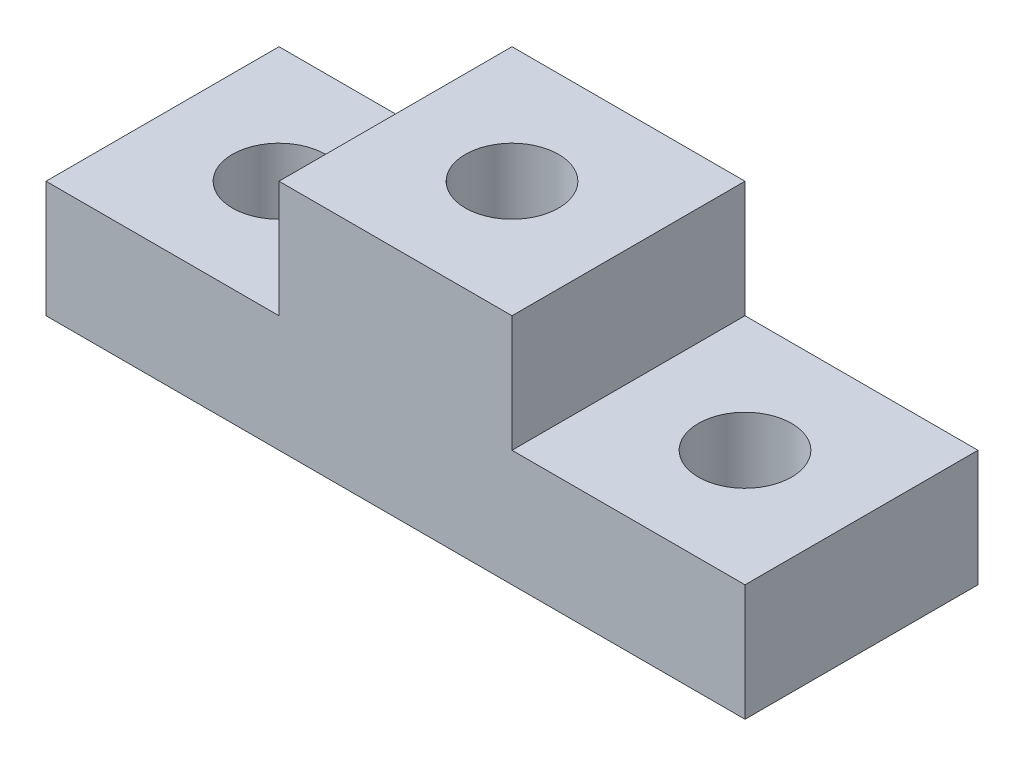
ISO-10303-21;
HEADER;
FILE_DESCRIPTION(('STEP AP214'),'2;1');
FILE_NAME('part.step','',(''),(''),'','','');
FILE_SCHEMA(('AUTOMOTIVE_DESIGN { 1 0 10303 214 1 1 1 1 }'));
ENDSEC;
DATA;
#1=APPLICATION_CONTEXT('core data for automotive mechanical design processes');
#2=APPLICATION_PROTOCOL_DEFINITION('international standard','automotive_design',2000,#1);
#3=PRODUCT_CONTEXT('',#1,'mechanical');
#4=PRODUCT('Part','Part','',(#3));
#5=PRODUCT_RELATED_PRODUCT_CATEGORY('part','',(#4));
#6=PRODUCT_DEFINITION_FORMATION('','',#4);
#7=PRODUCT_DEFINITION_CONTEXT('part definition',#1,'design');
#8=PRODUCT_DEFINITION('design','',#6,#7);
#9=PRODUCT_DEFINITION_SHAPE('','',#8);
#10=(LENGTH_UNIT() NAMED_UNIT(*) SI_UNIT(.MILLI.,.METRE.));
#11=(NAMED_UNIT(*) PLANE_ANGLE_UNIT() SI_UNIT($,.RADIAN.));
#12=(NAMED_UNIT(*) SI_UNIT($,.STERADIAN.) SOLID_ANGLE_UNIT());
#13=UNCERTAINTY_MEASURE_WITH_UNIT(LENGTH_MEASURE(1.E-05),#10,'distance_accuracy_value','');
#14=(GEOMETRIC_REPRESENTATION_CONTEXT(3) GLOBAL_UNCERTAINTY_ASSIGNED_CONTEXT((#13)) GLOBAL_UNIT_ASSIGNED_CONTEXT((#10,
#11,#12)) REPRESENTATION_CONTEXT('',''));
#15=CARTESIAN_POINT('',(0.,0.,0.));
#16=DIRECTION('',(0.,0.,1.));
#17=DIRECTION('',(1.,0.,0.));
#18=AXIS2_PLACEMENT_3D('',#15,#16,#17);
#19=CARTESIAN_POINT('',(30.,-5.,10.));
#20=DIRECTION('',(0.,-1.,0.));
#21=DIRECTION('',(0.,0.,-1.));
#22=AXIS2_PLACEMENT_3D('',#19,#20,#21);
#23=PLANE('',#22);
#24=CARTESIAN_POINT('',(25.,-4.99999999999999,5.));
#25=DIRECTION('',(0.,1.,0.));
#26=DIRECTION('',(-1.,0.,0.));
#27=AXIS2_PLACEMENT_3D('',#24,#25,#26);
#28=CIRCLE('',#27,2.);
#29=CARTESIAN_POINT('',(23.,-4.99999999999999,5.));
#30=VERTEX_POINT('',#29);
#31=EDGE_CURVE('E191',#30,#30,#28,.T.);
#32=ORIENTED_EDGE('',*,*,#31,.F.);
#33=EDGE_LOOP('',(#32));
#34=FACE_BOUND('',#33,.T.);
#35=DIRECTION('',(-1.,0.,0.));
#36=VECTOR('',#35,1.);
#37=CARTESIAN_POINT('',(30.,-5.,0.));
#38=LINE('',#37,#36);
#39=CARTESIAN_POINT('',(30.,-5.,0.));
#40=VERTEX_POINT('',#39);
#41=CARTESIAN_POINT('',(20.,-5.,0.));
#42=VERTEX_POINT('',#41);
#43=EDGE_CURVE('E131',#40,#42,#38,.T.);
#44=ORIENTED_EDGE('',*,*,#43,.T.);
#45=DIRECTION('',(0.,0.,-1.));
#46=VECTOR('',#45,1.);
#47=CARTESIAN_POINT('',(20.,-5.,10.));
#48=LINE('',#47,#46);
#49=CARTESIAN_POINT('',(20.,-5.,10.));
#50=VERTEX_POINT('',#49);
#51=EDGE_CURVE('E11',#50,#42,#48,.T.);
#52=ORIENTED_EDGE('',*,*,#51,.F.);
#53=DIRECTION('',(-1.,0.,0.));
#54=VECTOR('',#53,1.);
#55=CARTESIAN_POINT('',(30.,-5.,10.));
#56=LINE('',#55,#54);
#57=CARTESIAN_POINT('',(30.,-5.,10.));
#58=VERTEX_POINT('',#57);
#59=EDGE_CURVE('E146',#58,#50,#56,.T.);
#60=ORIENTED_EDGE('',*,*,#59,.F.);
#61=DIRECTION('',(0.,0.,-1.));
#62=VECTOR('',#61,1.);
#63=CARTESIAN_POINT('',(30.,-5.,10.));
#64=LINE('',#63,#62);
#65=EDGE_CURVE('E127',#58,#40,#64,.T.);
#66=ORIENTED_EDGE('',*,*,#65,.T.);
#67=EDGE_LOOP('',(#44,#52,#60,#66));
#68=FACE_BOUND('',#67,.T.);
#69=ADVANCED_FACE('F35',(#34,#68),#23,.F.);
#70=CARTESIAN_POINT('',(20.,-5.,10.));
#71=DIRECTION('',(-1.,0.,0.));
#72=DIRECTION('',(0.,0.,1.));
#73=AXIS2_PLACEMENT_3D('',#70,#71,#72);
#74=PLANE('',#73);
#75=DIRECTION('',(0.,1.,0.));
#76=VECTOR('',#75,1.);
#77=CARTESIAN_POINT('',(20.,-5.,0.));
#78=LINE('',#77,#76);
#79=CARTESIAN_POINT('',(20.,0.,0.));
#80=VERTEX_POINT('',#79);
#81=EDGE_CURVE('E134',#42,#80,#78,.T.);
#82=ORIENTED_EDGE('',*,*,#81,.T.);
#83=DIRECTION('',(0.,0.,-1.));
#84=VECTOR('',#83,1.);
#85=CARTESIAN_POINT('',(20.,0.,10.));
#86=LINE('',#85,#84);
#87=CARTESIAN_POINT('',(20.,0.,10.));
#88=VERTEX_POINT('',#87);
#89=EDGE_CURVE('E43',#88,#80,#86,.T.);
#90=ORIENTED_EDGE('',*,*,#89,.F.);
#91=DIRECTION('',(0.,1.,0.));
#92=VECTOR('',#91,1.);
#93=CARTESIAN_POINT('',(20.,-5.,10.));
#94=LINE('',#93,#92);
#95=EDGE_CURVE('E94',#50,#88,#94,.T.);
#96=ORIENTED_EDGE('',*,*,#95,.F.);
#97=ORIENTED_EDGE('',*,*,#51,.T.);
#98=EDGE_LOOP('',(#82,#90,#96,#97));
#99=FACE_BOUND('',#98,.T.);
#100=ADVANCED_FACE('F208',(#99),#74,.F.);
#101=CARTESIAN_POINT('',(10.,0.,10.));
#102=DIRECTION('',(0.,-1.,0.));
#103=DIRECTION('',(0.,0.,-1.));
#104=AXIS2_PLACEMENT_3D('',#101,#102,#103);
#105=PLANE('',#104);
#106=CARTESIAN_POINT('',(15.,0.,5.));
#107=DIRECTION('',(0.,1.,0.));
#108=DIRECTION('',(0.,0.,1.));
#109=AXIS2_PLACEMENT_3D('',#106,#107,#108);
#110=CIRCLE('',#109,2.);
#111=CARTESIAN_POINT('',(15.,0.,7.));
#112=VERTEX_POINT('',#111);
#113=EDGE_CURVE('E179',#112,#112,#110,.T.);
#114=ORIENTED_EDGE('',*,*,#113,.F.);
#115=EDGE_LOOP('',(#114));
#116=FACE_BOUND('',#115,.T.);
#117=DIRECTION('',(-1.,0.,0.));
#118=VECTOR('',#117,1.);
#119=CARTESIAN_POINT('',(10.,0.,0.));
#120=LINE('',#119,#118);
#121=CARTESIAN_POINT('',(10.,0.,0.));
#122=VERTEX_POINT('',#121);
#123=EDGE_CURVE('E137',#80,#122,#120,.T.);
#124=ORIENTED_EDGE('',*,*,#123,.T.);
#125=DIRECTION('',(0.,0.,-1.));
#126=VECTOR('',#125,1.);
#127=CARTESIAN_POINT('',(10.,0.,10.));
#128=LINE('',#127,#126);
#129=CARTESIAN_POINT('',(10.,0.,10.));
#130=VERTEX_POINT('',#129);
#131=EDGE_CURVE('E153',#130,#122,#128,.T.);
#132=ORIENTED_EDGE('',*,*,#131,.F.);
#133=DIRECTION('',(-1.,0.,0.));
#134=VECTOR('',#133,1.);
#135=CARTESIAN_POINT('',(10.,0.,10.));
#136=LINE('',#135,#134);
#137=EDGE_CURVE('E161',#88,#130,#136,.T.);
#138=ORIENTED_EDGE('',*,*,#137,.F.);
#139=ORIENTED_EDGE('',*,*,#89,.T.);
#140=EDGE_LOOP('',(#124,#132,#138,#139));
#141=FACE_BOUND('',#140,.T.);
#142=ADVANCED_FACE('F159',(#116,#141),#105,.F.);
#143=CARTESIAN_POINT('',(10.,-5.,10.));
#144=DIRECTION('',(1.,0.,0.));
#145=DIRECTION('',(0.,0.,-1.));
#146=AXIS2_PLACEMENT_3D('',#143,#144,#145);
#147=PLANE('',#146);
#148=DIRECTION('',(0.,-1.,0.));
#149=VECTOR('',#148,1.);
#150=CARTESIAN_POINT('',(10.,-5.,0.));
#151=LINE('',#150,#149);
#152=CARTESIAN_POINT('',(10.,-5.,0.));
#153=VERTEX_POINT('',#152);
#154=EDGE_CURVE('E139',#122,#153,#151,.T.);
#155=ORIENTED_EDGE('',*,*,#154,.T.);
#156=DIRECTION('',(0.,0.,-1.));
#157=VECTOR('',#156,1.);
#158=CARTESIAN_POINT('',(10.,-5.,10.));
#159=LINE('',#158,#157);
#160=CARTESIAN_POINT('',(10.,-5.,10.));
#161=VERTEX_POINT('',#160);
#162=EDGE_CURVE('E150',#161,#153,#159,.T.);
#163=ORIENTED_EDGE('',*,*,#162,.F.);
#164=DIRECTION('',(0.,-1.,0.));
#165=VECTOR('',#164,1.);
#166=CARTESIAN_POINT('',(10.,-5.,10.));
#167=LINE('',#166,#165);
#168=EDGE_CURVE('E173',#130,#161,#167,.T.);
#169=ORIENTED_EDGE('',*,*,#168,.F.);
#170=ORIENTED_EDGE('',*,*,#131,.T.);
#171=EDGE_LOOP('',(#155,#163,#169,#170));
#172=FACE_BOUND('',#171,.T.);
#173=ADVANCED_FACE('F169',(#172),#147,.F.);
#174=CARTESIAN_POINT('',(0.,-5.,10.));
#175=DIRECTION('',(0.,-1.,0.));
#176=DIRECTION('',(1.,0.,0.));
#177=AXIS2_PLACEMENT_3D('',#174,#175,#176);
#178=PLANE('',#177);
#179=CARTESIAN_POINT('',(5.,-5.,5.));
#180=DIRECTION('',(0.,1.,0.));
#181=DIRECTION('',(-1.,0.,0.));
#182=AXIS2_PLACEMENT_3D('',#179,#180,#181);
#183=CIRCLE('',#182,2.);
#184=CARTESIAN_POINT('',(3.,-5.,5.));
#185=VERTEX_POINT('',#184);
#186=EDGE_CURVE('E185',#185,#185,#183,.T.);
#187=ORIENTED_EDGE('',*,*,#186,.F.);
#188=EDGE_LOOP('',(#187));
#189=FACE_BOUND('',#188,.T.);
#190=DIRECTION('',(-1.,0.,0.));
#191=VECTOR('',#190,1.);
#192=CARTESIAN_POINT('',(0.,-5.,0.));
#193=LINE('',#192,#191);
#194=CARTESIAN_POINT('',(0.,-5.,0.));
#195=VERTEX_POINT('',#194);
#196=EDGE_CURVE('E141',#153,#195,#193,.T.);
#197=ORIENTED_EDGE('',*,*,#196,.T.);
#198=DIRECTION('',(0.,0.,-1.));
#199=VECTOR('',#198,1.);
#200=CARTESIAN_POINT('',(0.,-5.,10.));
#201=LINE('',#200,#199);
#202=CARTESIAN_POINT('',(0.,-5.,10.));
#203=VERTEX_POINT('',#202);
#204=EDGE_CURVE('E122',#203,#195,#201,.T.);
#205=ORIENTED_EDGE('',*,*,#204,.F.);
#206=DIRECTION('',(-1.,0.,0.));
#207=VECTOR('',#206,1.);
#208=CARTESIAN_POINT('',(0.,-5.,10.));
#209=LINE('',#208,#207);
#210=EDGE_CURVE('E113',#161,#203,#209,.T.);
#211=ORIENTED_EDGE('',*,*,#210,.F.);
#212=ORIENTED_EDGE('',*,*,#162,.T.);
#213=EDGE_LOOP('',(#197,#205,#211,#212));
#214=FACE_BOUND('',#213,.T.);
#215=ADVANCED_FACE('F172',(#189,#214),#178,.F.);
#216=CARTESIAN_POINT('',(0.,-5.,10.));
#217=DIRECTION('',(1.,0.,0.));
#218=DIRECTION('',(0.,1.,0.));
#219=AXIS2_PLACEMENT_3D('',#216,#217,#218);
#220=PLANE('',#219);
#221=DIRECTION('',(0.,-1.,0.));
#222=VECTOR('',#221,1.);
#223=CARTESIAN_POINT('',(0.,-5.,0.));
#224=LINE('',#223,#222);
#225=CARTESIAN_POINT('',(0.,-10.,0.));
#226=VERTEX_POINT('',#225);
#227=EDGE_CURVE('E121',#195,#226,#224,.T.);
#228=ORIENTED_EDGE('',*,*,#227,.T.);
#229=DIRECTION('',(0.,0.,-1.));
#230=VECTOR('',#229,1.);
#231=CARTESIAN_POINT('',(0.,-10.,10.));
#232=LINE('',#231,#230);
#233=CARTESIAN_POINT('',(0.,-10.,10.));
#234=VERTEX_POINT('',#233);
#235=EDGE_CURVE('E118',#234,#226,#232,.T.);
#236=ORIENTED_EDGE('',*,*,#235,.F.);
#237=DIRECTION('',(0.,-1.,0.));
#238=VECTOR('',#237,1.);
#239=CARTESIAN_POINT('',(0.,-5.,10.));
#240=LINE('',#239,#238);
#241=EDGE_CURVE('E107',#203,#234,#240,.T.);
#242=ORIENTED_EDGE('',*,*,#241,.F.);
#243=ORIENTED_EDGE('',*,*,#204,.T.);
#244=EDGE_LOOP('',(#228,#236,#242,#243));
#245=FACE_BOUND('',#244,.T.);
#246=ADVANCED_FACE('F119',(#245),#220,.F.);
#247=CARTESIAN_POINT('',(0.,-10.,10.));
#248=DIRECTION('',(0.,1.,0.));
#249=DIRECTION('',(0.,0.,1.));
#250=AXIS2_PLACEMENT_3D('',#247,#248,#249);
#251=PLANE('',#250);
#252=CARTESIAN_POINT('',(25.,-10.,5.));
#253=DIRECTION('',(0.,1.,0.));
#254=DIRECTION('',(-1.,0.,0.));
#255=AXIS2_PLACEMENT_3D('',#252,#253,#254);
#256=CIRCLE('',#255,2.);
#257=CARTESIAN_POINT('',(23.,-10.,5.));
#258=VERTEX_POINT('',#257);
#259=EDGE_CURVE('E188',#258,#258,#256,.T.);
#260=ORIENTED_EDGE('',*,*,#259,.T.);
#261=EDGE_LOOP('',(#260));
#262=FACE_BOUND('',#261,.T.);
#263=CARTESIAN_POINT('',(5.,-10.,5.));
#264=DIRECTION('',(0.,1.,0.));
#265=DIRECTION('',(-1.,0.,0.));
#266=AXIS2_PLACEMENT_3D('',#263,#264,#265);
#267=CIRCLE('',#266,2.);
#268=CARTESIAN_POINT('',(3.,-10.,5.));
#269=VERTEX_POINT('',#268);
#270=EDGE_CURVE('E182',#269,#269,#267,.T.);
#271=ORIENTED_EDGE('',*,*,#270,.T.);
#272=EDGE_LOOP('',(#271));
#273=FACE_BOUND('',#272,.T.);
#274=CARTESIAN_POINT('',(15.,-10.,5.));
#275=DIRECTION('',(0.,1.,0.));
#276=DIRECTION('',(0.,0.,1.));
#277=AXIS2_PLACEMENT_3D('',#274,#275,#276);
#278=CIRCLE('',#277,2.);
#279=CARTESIAN_POINT('',(15.,-10.,7.));
#280=VERTEX_POINT('',#279);
#281=EDGE_CURVE('E135',#280,#280,#278,.T.);
#282=ORIENTED_EDGE('',*,*,#281,.T.);
#283=EDGE_LOOP('',(#282));
#284=FACE_BOUND('',#283,.T.);
#285=DIRECTION('',(1.,0.,0.));
#286=VECTOR('',#285,1.);
#287=CARTESIAN_POINT('',(0.,-10.,0.));
#288=LINE('',#287,#286);
#289=CARTESIAN_POINT('',(30.,-10.,0.));
#290=VERTEX_POINT('',#289);
#291=EDGE_CURVE('E80',#226,#290,#288,.T.);
#292=ORIENTED_EDGE('',*,*,#291,.T.);
#293=DIRECTION('',(0.,0.,-1.));
#294=VECTOR('',#293,1.);
#295=CARTESIAN_POINT('',(30.,-10.,10.));
#296=LINE('',#295,#294);
#297=CARTESIAN_POINT('',(30.,-10.,10.));
#298=VERTEX_POINT('',#297);
#299=EDGE_CURVE('E123',#298,#290,#296,.T.);
#300=ORIENTED_EDGE('',*,*,#299,.F.);
#301=DIRECTION('',(1.,0.,0.));
#302=VECTOR('',#301,1.);
#303=CARTESIAN_POINT('',(0.,-10.,10.));
#304=LINE('',#303,#302);
#305=EDGE_CURVE('E111',#234,#298,#304,.T.);
#306=ORIENTED_EDGE('',*,*,#305,.F.);
#307=ORIENTED_EDGE('',*,*,#235,.T.);
#308=EDGE_LOOP('',(#292,#300,#306,#307));
#309=FACE_BOUND('',#308,.T.);
#310=ADVANCED_FACE('F125',(#262,#273,#284,#309),#251,.F.);
#311=CARTESIAN_POINT('',(30.,-5.,10.));
#312=DIRECTION('',(-1.,0.,0.));
#313=DIRECTION('',(0.,0.,1.));
#314=AXIS2_PLACEMENT_3D('',#311,#312,#313);
#315=PLANE('',#314);
#316=DIRECTION('',(0.,1.,0.));
#317=VECTOR('',#316,1.);
#318=CARTESIAN_POINT('',(30.,-5.,0.));
#319=LINE('',#318,#317);
#320=EDGE_CURVE('E86',#290,#40,#319,.T.);
#321=ORIENTED_EDGE('',*,*,#320,.T.);
#322=ORIENTED_EDGE('',*,*,#65,.F.);
#323=DIRECTION('',(0.,1.,0.));
#324=VECTOR('',#323,1.);
#325=CARTESIAN_POINT('',(30.,-5.,10.));
#326=LINE('',#325,#324);
#327=EDGE_CURVE('E51',#298,#58,#326,.T.);
#328=ORIENTED_EDGE('',*,*,#327,.F.);
#329=ORIENTED_EDGE('',*,*,#299,.T.);
#330=EDGE_LOOP('',(#321,#322,#328,#329));
#331=FACE_BOUND('',#330,.T.);
#332=ADVANCED_FACE('F211',(#331),#315,.F.);
#333=CARTESIAN_POINT('',(0.,0.,10.));
#334=DIRECTION('',(0.,0.,-1.));
#335=DIRECTION('',(-1.,0.,0.));
#336=AXIS2_PLACEMENT_3D('',#333,#334,#335);
#337=PLANE('',#336);
#338=ORIENTED_EDGE('',*,*,#59,.T.);
#339=ORIENTED_EDGE('',*,*,#95,.T.);
#340=ORIENTED_EDGE('',*,*,#137,.T.);
#341=ORIENTED_EDGE('',*,*,#168,.T.);
#342=ORIENTED_EDGE('',*,*,#210,.T.);
#343=ORIENTED_EDGE('',*,*,#241,.T.);
#344=ORIENTED_EDGE('',*,*,#305,.T.);
#345=ORIENTED_EDGE('',*,*,#327,.T.);
#346=EDGE_LOOP('',(#338,#339,#340,#341,#342,#343,#344,#345));
#347=FACE_BOUND('',#346,.T.);
#348=ADVANCED_FACE('F109',(#347),#337,.F.);
#349=CARTESIAN_POINT('',(0.,0.,0.));
#350=DIRECTION('',(0.,0.,-1.));
#351=DIRECTION('',(-1.,0.,0.));
#352=AXIS2_PLACEMENT_3D('',#349,#350,#351);
#353=PLANE('',#352);
#354=ORIENTED_EDGE('',*,*,#43,.F.);
#355=ORIENTED_EDGE('',*,*,#320,.F.);
#356=ORIENTED_EDGE('',*,*,#291,.F.);
#357=ORIENTED_EDGE('',*,*,#227,.F.);
#358=ORIENTED_EDGE('',*,*,#196,.F.);
#359=ORIENTED_EDGE('',*,*,#154,.F.);
#360=ORIENTED_EDGE('',*,*,#123,.F.);
#361=ORIENTED_EDGE('',*,*,#81,.F.);
#362=EDGE_LOOP('',(#354,#355,#356,#357,#358,#359,#360,#361));
#363=FACE_BOUND('',#362,.T.);
#364=ADVANCED_FACE('F165',(#363),#353,.T.);
#365=CARTESIAN_POINT('',(15.,-10.,5.));
#366=DIRECTION('',(0.,1.,0.));
#367=DIRECTION('',(0.,0.,1.));
#368=AXIS2_PLACEMENT_3D('',#365,#366,#367);
#369=CYLINDRICAL_SURFACE('',#368,2.);
#370=ORIENTED_EDGE('',*,*,#281,.F.);
#371=EDGE_LOOP('',(#370));
#372=FACE_BOUND('',#371,.T.);
#373=ORIENTED_EDGE('',*,*,#113,.T.);
#374=EDGE_LOOP('',(#373));
#375=FACE_BOUND('',#374,.T.);
#376=ADVANCED_FACE('F268',(#372,#375),#369,.F.);
#377=CARTESIAN_POINT('',(5.,-10.,5.));
#378=DIRECTION('',(0.,1.,0.));
#379=DIRECTION('',(-1.,0.,0.));
#380=AXIS2_PLACEMENT_3D('',#377,#378,#379);
#381=CYLINDRICAL_SURFACE('',#380,2.);
#382=ORIENTED_EDGE('',*,*,#270,.F.);
#383=EDGE_LOOP('',(#382));
#384=FACE_BOUND('',#383,.T.);
#385=ORIENTED_EDGE('',*,*,#186,.T.);
#386=EDGE_LOOP('',(#385));
#387=FACE_BOUND('',#386,.T.);
#388=ADVANCED_FACE('F202',(#384,#387),#381,.F.);
#389=CARTESIAN_POINT('',(25.,-10.,5.));
#390=DIRECTION('',(0.,1.,0.));
#391=DIRECTION('',(-1.,0.,0.));
#392=AXIS2_PLACEMENT_3D('',#389,#390,#391);
#393=CYLINDRICAL_SURFACE('',#392,2.);
#394=ORIENTED_EDGE('',*,*,#259,.F.);
#395=EDGE_LOOP('',(#394));
#396=FACE_BOUND('',#395,.T.);
#397=ORIENTED_EDGE('',*,*,#31,.T.);
#398=EDGE_LOOP('',(#397));
#399=FACE_BOUND('',#398,.T.);
#400=ADVANCED_FACE('F199',(#396,#399),#393,.F.);
#401=CLOSED_SHELL('',(#69,#100,#142,#173,#215,#246,#310,#332,#348,#364,#376,#388,#400));
#402=MANIFOLD_SOLID_BREP('B2',#401);
#403=ADVANCED_BREP_SHAPE_REPRESENTATION('',(#18,#402),#14);
#404=SHAPE_DEFINITION_REPRESENTATION(#9,#403);
ENDSEC;
END-ISO-10303-21;
